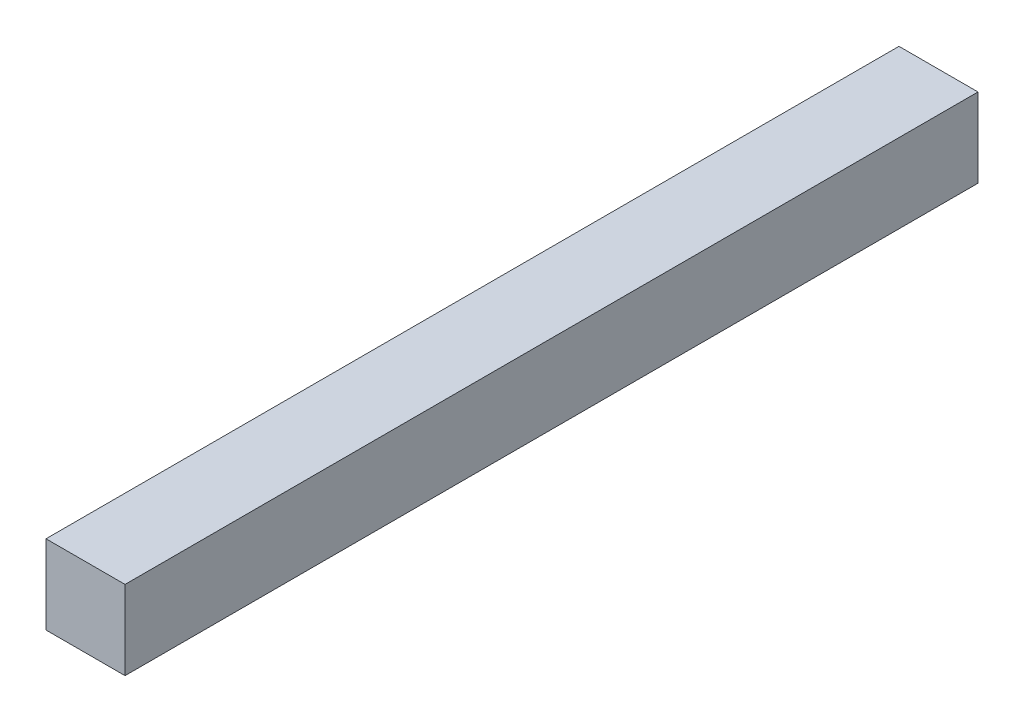
ISO-10303-21;
HEADER;
FILE_DESCRIPTION(('STEP AP214'),'2;1');
FILE_NAME('part.step','',(''),(''),'','','');
FILE_SCHEMA(('AUTOMOTIVE_DESIGN { 1 0 10303 214 1 1 1 1 }'));
ENDSEC;
DATA;
#1=APPLICATION_CONTEXT('core data for automotive mechanical design processes');
#2=APPLICATION_PROTOCOL_DEFINITION('international standard','automotive_design',2000,#1);
#3=PRODUCT_CONTEXT('',#1,'mechanical');
#4=PRODUCT('Part','Part','',(#3));
#5=PRODUCT_RELATED_PRODUCT_CATEGORY('part','',(#4));
#6=PRODUCT_DEFINITION_FORMATION('','',#4);
#7=PRODUCT_DEFINITION_CONTEXT('part definition',#1,'design');
#8=PRODUCT_DEFINITION('design','',#6,#7);
#9=PRODUCT_DEFINITION_SHAPE('','',#8);
#10=(LENGTH_UNIT() NAMED_UNIT(*) SI_UNIT(.MILLI.,.METRE.));
#11=(NAMED_UNIT(*) PLANE_ANGLE_UNIT() SI_UNIT($,.RADIAN.));
#12=(NAMED_UNIT(*) SI_UNIT($,.STERADIAN.) SOLID_ANGLE_UNIT());
#13=UNCERTAINTY_MEASURE_WITH_UNIT(LENGTH_MEASURE(1.E-05),#10,'distance_accuracy_value','');
#14=(GEOMETRIC_REPRESENTATION_CONTEXT(3) GLOBAL_UNCERTAINTY_ASSIGNED_CONTEXT((#13)) GLOBAL_UNIT_ASSIGNED_CONTEXT((#10,
#11,#12)) REPRESENTATION_CONTEXT('',''));
#15=CARTESIAN_POINT('',(0.,0.,0.));
#16=DIRECTION('',(0.,0.,1.));
#17=DIRECTION('',(1.,0.,0.));
#18=AXIS2_PLACEMENT_3D('',#15,#16,#17);
#19=CARTESIAN_POINT('',(1.39,1.39,15.));
#20=DIRECTION('',(-1.,0.,0.));
#21=DIRECTION('',(0.,-1.,0.));
#22=AXIS2_PLACEMENT_3D('',#19,#20,#21);
#23=PLANE('',#22);
#24=DIRECTION('',(0.,1.,0.));
#25=VECTOR('',#24,1.);
#26=CARTESIAN_POINT('',(1.39,1.39,-15.));
#27=LINE('',#26,#25);
#28=CARTESIAN_POINT('',(1.39,-1.39,-15.));
#29=VERTEX_POINT('',#28);
#30=CARTESIAN_POINT('',(1.39,1.39,-15.));
#31=VERTEX_POINT('',#30);
#32=EDGE_CURVE('E95',#29,#31,#27,.T.);
#33=ORIENTED_EDGE('',*,*,#32,.T.);
#34=DIRECTION('',(0.,0.,-1.));
#35=VECTOR('',#34,1.);
#36=CARTESIAN_POINT('',(1.39,1.39,15.));
#37=LINE('',#36,#35);
#38=CARTESIAN_POINT('',(1.39,1.39,15.));
#39=VERTEX_POINT('',#38);
#40=EDGE_CURVE('E11',#39,#31,#37,.T.);
#41=ORIENTED_EDGE('',*,*,#40,.F.);
#42=DIRECTION('',(0.,1.,0.));
#43=VECTOR('',#42,1.);
#44=CARTESIAN_POINT('',(1.39,1.39,15.));
#45=LINE('',#44,#43);
#46=CARTESIAN_POINT('',(1.39,-1.39,15.));
#47=VERTEX_POINT('',#46);
#48=EDGE_CURVE('E83',#47,#39,#45,.T.);
#49=ORIENTED_EDGE('',*,*,#48,.F.);
#50=DIRECTION('',(0.,0.,-1.));
#51=VECTOR('',#50,1.);
#52=CARTESIAN_POINT('',(1.39,-1.39,15.));
#53=LINE('',#52,#51);
#54=EDGE_CURVE('E91',#47,#29,#53,.T.);
#55=ORIENTED_EDGE('',*,*,#54,.T.);
#56=EDGE_LOOP('',(#33,#41,#49,#55));
#57=FACE_BOUND('',#56,.T.);
#58=ADVANCED_FACE('F32',(#57),#23,.F.);
#59=CARTESIAN_POINT('',(-1.39,1.39,15.));
#60=DIRECTION('',(0.,-1.,0.));
#61=DIRECTION('',(0.,0.,-1.));
#62=AXIS2_PLACEMENT_3D('',#59,#60,#61);
#63=PLANE('',#62);
#64=DIRECTION('',(-1.,0.,0.));
#65=VECTOR('',#64,1.);
#66=CARTESIAN_POINT('',(-1.39,1.39,-15.));
#67=LINE('',#66,#65);
#68=CARTESIAN_POINT('',(-1.39,1.39,-15.));
#69=VERTEX_POINT('',#68);
#70=EDGE_CURVE('E87',#31,#69,#67,.T.);
#71=ORIENTED_EDGE('',*,*,#70,.T.);
#72=DIRECTION('',(0.,0.,-1.));
#73=VECTOR('',#72,1.);
#74=CARTESIAN_POINT('',(-1.39,1.39,15.));
#75=LINE('',#74,#73);
#76=CARTESIAN_POINT('',(-1.39,1.39,15.));
#77=VERTEX_POINT('',#76);
#78=EDGE_CURVE('E40',#77,#69,#75,.T.);
#79=ORIENTED_EDGE('',*,*,#78,.F.);
#80=DIRECTION('',(-1.,0.,0.));
#81=VECTOR('',#80,1.);
#82=CARTESIAN_POINT('',(-1.39,1.39,15.));
#83=LINE('',#82,#81);
#84=EDGE_CURVE('E78',#39,#77,#83,.T.);
#85=ORIENTED_EDGE('',*,*,#84,.F.);
#86=ORIENTED_EDGE('',*,*,#40,.T.);
#87=EDGE_LOOP('',(#71,#79,#85,#86));
#88=FACE_BOUND('',#87,.T.);
#89=ADVANCED_FACE('F86',(#88),#63,.F.);
#90=CARTESIAN_POINT('',(-1.39,1.39,15.));
#91=DIRECTION('',(1.,0.,0.));
#92=DIRECTION('',(0.,1.,0.));
#93=AXIS2_PLACEMENT_3D('',#90,#91,#92);
#94=PLANE('',#93);
#95=DIRECTION('',(0.,-1.,0.));
#96=VECTOR('',#95,1.);
#97=CARTESIAN_POINT('',(-1.39,1.39,-15.));
#98=LINE('',#97,#96);
#99=CARTESIAN_POINT('',(-1.39,-1.39,-15.));
#100=VERTEX_POINT('',#99);
#101=EDGE_CURVE('E65',#69,#100,#98,.T.);
#102=ORIENTED_EDGE('',*,*,#101,.T.);
#103=DIRECTION('',(0.,0.,-1.));
#104=VECTOR('',#103,1.);
#105=CARTESIAN_POINT('',(-1.39,-1.39,15.));
#106=LINE('',#105,#104);
#107=CARTESIAN_POINT('',(-1.39,-1.39,15.));
#108=VERTEX_POINT('',#107);
#109=EDGE_CURVE('E88',#108,#100,#106,.T.);
#110=ORIENTED_EDGE('',*,*,#109,.F.);
#111=DIRECTION('',(0.,-1.,0.));
#112=VECTOR('',#111,1.);
#113=CARTESIAN_POINT('',(-1.39,1.39,15.));
#114=LINE('',#113,#112);
#115=EDGE_CURVE('E81',#77,#108,#114,.T.);
#116=ORIENTED_EDGE('',*,*,#115,.F.);
#117=ORIENTED_EDGE('',*,*,#78,.T.);
#118=EDGE_LOOP('',(#102,#110,#116,#117));
#119=FACE_BOUND('',#118,.T.);
#120=ADVANCED_FACE('F89',(#119),#94,.F.);
#121=CARTESIAN_POINT('',(-1.39,-1.39,15.));
#122=DIRECTION('',(0.,1.,0.));
#123=DIRECTION('',(0.,0.,1.));
#124=AXIS2_PLACEMENT_3D('',#121,#122,#123);
#125=PLANE('',#124);
#126=DIRECTION('',(1.,0.,0.));
#127=VECTOR('',#126,1.);
#128=CARTESIAN_POINT('',(-1.39,-1.39,-15.));
#129=LINE('',#128,#127);
#130=EDGE_CURVE('E71',#100,#29,#129,.T.);
#131=ORIENTED_EDGE('',*,*,#130,.T.);
#132=ORIENTED_EDGE('',*,*,#54,.F.);
#133=DIRECTION('',(1.,0.,0.));
#134=VECTOR('',#133,1.);
#135=CARTESIAN_POINT('',(-1.39,-1.39,15.));
#136=LINE('',#135,#134);
#137=EDGE_CURVE('E48',#108,#47,#136,.T.);
#138=ORIENTED_EDGE('',*,*,#137,.F.);
#139=ORIENTED_EDGE('',*,*,#109,.T.);
#140=EDGE_LOOP('',(#131,#132,#138,#139));
#141=FACE_BOUND('',#140,.T.);
#142=ADVANCED_FACE('F102',(#141),#125,.F.);
#143=CARTESIAN_POINT('',(0.,0.,15.));
#144=DIRECTION('',(0.,0.,1.));
#145=DIRECTION('',(1.,0.,0.));
#146=AXIS2_PLACEMENT_3D('',#143,#144,#145);
#147=PLANE('',#146);
#148=ORIENTED_EDGE('',*,*,#48,.T.);
#149=ORIENTED_EDGE('',*,*,#84,.T.);
#150=ORIENTED_EDGE('',*,*,#115,.T.);
#151=ORIENTED_EDGE('',*,*,#137,.T.);
#152=EDGE_LOOP('',(#148,#149,#150,#151));
#153=FACE_BOUND('',#152,.T.);
#154=ADVANCED_FACE('F79',(#153),#147,.T.);
#155=CARTESIAN_POINT('',(0.,0.,-15.));
#156=DIRECTION('',(0.,0.,1.));
#157=DIRECTION('',(1.,0.,0.));
#158=AXIS2_PLACEMENT_3D('',#155,#156,#157);
#159=PLANE('',#158);
#160=ORIENTED_EDGE('',*,*,#32,.F.);
#161=ORIENTED_EDGE('',*,*,#130,.F.);
#162=ORIENTED_EDGE('',*,*,#101,.F.);
#163=ORIENTED_EDGE('',*,*,#70,.F.);
#164=EDGE_LOOP('',(#160,#161,#162,#163));
#165=FACE_BOUND('',#164,.T.);
#166=ADVANCED_FACE('F105',(#165),#159,.F.);
#167=CLOSED_SHELL('',(#58,#89,#120,#142,#154,#166));
#168=MANIFOLD_SOLID_BREP('B2',#167);
#169=ADVANCED_BREP_SHAPE_REPRESENTATION('',(#18,#168),#14);
#170=SHAPE_DEFINITION_REPRESENTATION(#9,#169);
ENDSEC;
END-ISO-10303-21;
